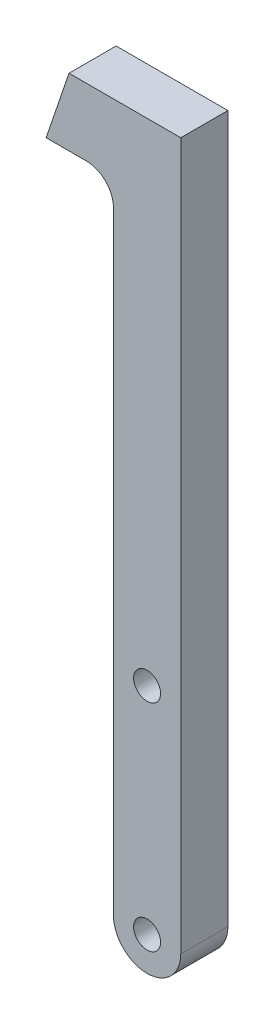
ISO-10303-21;
HEADER;
FILE_DESCRIPTION(('STEP AP214'),'2;1');
FILE_NAME('part.step','',(''),(''),'','','');
FILE_SCHEMA(('AUTOMOTIVE_DESIGN { 1 0 10303 214 1 1 1 1 }'));
ENDSEC;
DATA;
#1=APPLICATION_CONTEXT('core data for automotive mechanical design processes');
#2=APPLICATION_PROTOCOL_DEFINITION('international standard','automotive_design',2000,#1);
#3=PRODUCT_CONTEXT('',#1,'mechanical');
#4=PRODUCT('Part','Part','',(#3));
#5=PRODUCT_RELATED_PRODUCT_CATEGORY('part','',(#4));
#6=PRODUCT_DEFINITION_FORMATION('','',#4);
#7=PRODUCT_DEFINITION_CONTEXT('part definition',#1,'design');
#8=PRODUCT_DEFINITION('design','',#6,#7);
#9=PRODUCT_DEFINITION_SHAPE('','',#8);
#10=(LENGTH_UNIT() NAMED_UNIT(*) SI_UNIT(.MILLI.,.METRE.));
#11=(NAMED_UNIT(*) PLANE_ANGLE_UNIT() SI_UNIT($,.RADIAN.));
#12=(NAMED_UNIT(*) SI_UNIT($,.STERADIAN.) SOLID_ANGLE_UNIT());
#13=UNCERTAINTY_MEASURE_WITH_UNIT(LENGTH_MEASURE(1.E-05),#10,'distance_accuracy_value','');
#14=(GEOMETRIC_REPRESENTATION_CONTEXT(3) GLOBAL_UNCERTAINTY_ASSIGNED_CONTEXT((#13)) GLOBAL_UNIT_ASSIGNED_CONTEXT((#10,
#11,#12)) REPRESENTATION_CONTEXT('',''));
#15=CARTESIAN_POINT('',(0.,0.,0.));
#16=DIRECTION('',(0.,0.,1.));
#17=DIRECTION('',(1.,0.,0.));
#18=AXIS2_PLACEMENT_3D('',#15,#16,#17);
#19=CARTESIAN_POINT('',(0.,-5.,3.5));
#20=DIRECTION('',(0.,1.,0.));
#21=DIRECTION('',(0.,0.,1.));
#22=AXIS2_PLACEMENT_3D('',#19,#20,#21);
#23=PLANE('',#22);
#24=DIRECTION('',(1.,0.,0.));
#25=VECTOR('',#24,1.);
#26=CARTESIAN_POINT('',(0.,-5.,0.));
#27=LINE('',#26,#25);
#28=CARTESIAN_POINT('',(0.,-5.,0.));
#29=VERTEX_POINT('',#28);
#30=CARTESIAN_POINT('',(3.,-5.,0.));
#31=VERTEX_POINT('',#30);
#32=EDGE_CURVE('E102',#29,#31,#27,.T.);
#33=ORIENTED_EDGE('',*,*,#32,.T.);
#34=DIRECTION('',(0.,0.,-1.));
#35=VECTOR('',#34,1.);
#36=CARTESIAN_POINT('',(3.,-5.,3.5));
#37=LINE('',#36,#35);
#38=CARTESIAN_POINT('',(3.,-5.,3.5));
#39=VERTEX_POINT('',#38);
#40=EDGE_CURVE('E48',#31,#39,#37,.F.);
#41=ORIENTED_EDGE('',*,*,#40,.T.);
#42=DIRECTION('',(1.,0.,0.));
#43=VECTOR('',#42,1.);
#44=CARTESIAN_POINT('',(0.,-5.,3.5));
#45=LINE('',#44,#43);
#46=CARTESIAN_POINT('',(0.,-5.,3.5));
#47=VERTEX_POINT('',#46);
#48=EDGE_CURVE('E107',#47,#39,#45,.T.);
#49=ORIENTED_EDGE('',*,*,#48,.F.);
#50=DIRECTION('',(0.,0.,-1.));
#51=VECTOR('',#50,1.);
#52=CARTESIAN_POINT('',(0.,-5.,3.5));
#53=LINE('',#52,#51);
#54=EDGE_CURVE('E94',#47,#29,#53,.T.);
#55=ORIENTED_EDGE('',*,*,#54,.T.);
#56=EDGE_LOOP('',(#33,#41,#49,#55));
#57=FACE_BOUND('',#56,.T.);
#58=ADVANCED_FACE('F33',(#57),#23,.F.);
#59=CARTESIAN_POINT('',(5.,-5.,3.5));
#60=DIRECTION('',(1.,0.,0.));
#61=DIRECTION('',(0.,1.,0.));
#62=AXIS2_PLACEMENT_3D('',#59,#60,#61);
#63=PLANE('',#62);
#64=DIRECTION('',(0.,-1.,0.));
#65=VECTOR('',#64,1.);
#66=CARTESIAN_POINT('',(5.,-5.,3.5));
#67=LINE('',#66,#65);
#68=CARTESIAN_POINT('',(5.,-7.,3.5));
#69=VERTEX_POINT('',#68);
#70=CARTESIAN_POINT('',(5.00000000000001,-52.5,3.5));
#71=VERTEX_POINT('',#70);
#72=EDGE_CURVE('E137',#69,#71,#67,.T.);
#73=ORIENTED_EDGE('',*,*,#72,.F.);
#74=DIRECTION('',(0.,0.,-1.));
#75=VECTOR('',#74,1.);
#76=CARTESIAN_POINT('',(5.,-7.,0.));
#77=LINE('',#76,#75);
#78=CARTESIAN_POINT('',(5.,-7.,0.));
#79=VERTEX_POINT('',#78);
#80=EDGE_CURVE('E108',#69,#79,#77,.T.);
#81=ORIENTED_EDGE('',*,*,#80,.T.);
#82=DIRECTION('',(0.,-1.,0.));
#83=VECTOR('',#82,1.);
#84=CARTESIAN_POINT('',(5.,-5.,0.));
#85=LINE('',#84,#83);
#86=CARTESIAN_POINT('',(5.00000000000001,-52.5,0.));
#87=VERTEX_POINT('',#86);
#88=EDGE_CURVE('E104',#79,#87,#85,.T.);
#89=ORIENTED_EDGE('',*,*,#88,.T.);
#90=DIRECTION('',(0.,0.,-1.));
#91=VECTOR('',#90,1.);
#92=CARTESIAN_POINT('',(5.00000000000001,-52.5,3.5));
#93=LINE('',#92,#91);
#94=EDGE_CURVE('E109',#71,#87,#93,.T.);
#95=ORIENTED_EDGE('',*,*,#94,.F.);
#96=EDGE_LOOP('',(#73,#81,#89,#95));
#97=FACE_BOUND('',#96,.T.);
#98=ADVANCED_FACE('F175',(#97),#63,.F.);
#99=CARTESIAN_POINT('',(7.50000000000001,-52.5,3.5));
#100=DIRECTION('',(0.,0.,-1.));
#101=DIRECTION('',(-1.,0.,0.));
#102=AXIS2_PLACEMENT_3D('',#99,#100,#101);
#103=CYLINDRICAL_SURFACE('',#102,2.5);
#104=CARTESIAN_POINT('',(7.50000000000001,-52.5,0.));
#105=DIRECTION('',(0.,0.,1.));
#106=DIRECTION('',(1.,0.,0.));
#107=AXIS2_PLACEMENT_3D('',#104,#105,#106);
#108=CIRCLE('',#107,2.5);
#109=CARTESIAN_POINT('',(10.,-52.5,0.));
#110=VERTEX_POINT('',#109);
#111=EDGE_CURVE('E149',#87,#110,#108,.T.);
#112=ORIENTED_EDGE('',*,*,#111,.T.);
#113=DIRECTION('',(0.,0.,-1.));
#114=VECTOR('',#113,1.);
#115=CARTESIAN_POINT('',(10.,-52.5,3.5));
#116=LINE('',#115,#114);
#117=CARTESIAN_POINT('',(10.,-52.5,3.5));
#118=VERTEX_POINT('',#117);
#119=EDGE_CURVE('E114',#118,#110,#116,.T.);
#120=ORIENTED_EDGE('',*,*,#119,.F.);
#121=CARTESIAN_POINT('',(7.50000000000001,-52.5,3.5));
#122=DIRECTION('',(0.,0.,1.));
#123=DIRECTION('',(1.,0.,0.));
#124=AXIS2_PLACEMENT_3D('',#121,#122,#123);
#125=CIRCLE('',#124,2.5);
#126=EDGE_CURVE('E140',#71,#118,#125,.T.);
#127=ORIENTED_EDGE('',*,*,#126,.F.);
#128=ORIENTED_EDGE('',*,*,#94,.T.);
#129=EDGE_LOOP('',(#112,#120,#127,#128));
#130=FACE_BOUND('',#129,.T.);
#131=ADVANCED_FACE('F173',(#130),#103,.T.);
#132=CARTESIAN_POINT('',(10.,0.,3.5));
#133=DIRECTION('',(-1.,0.,0.));
#134=DIRECTION('',(0.,-1.,0.));
#135=AXIS2_PLACEMENT_3D('',#132,#133,#134);
#136=PLANE('',#135);
#137=DIRECTION('',(0.,1.,0.));
#138=VECTOR('',#137,1.);
#139=CARTESIAN_POINT('',(10.,0.,0.));
#140=LINE('',#139,#138);
#141=CARTESIAN_POINT('',(10.,0.,0.));
#142=VERTEX_POINT('',#141);
#143=EDGE_CURVE('E151',#110,#142,#140,.T.);
#144=ORIENTED_EDGE('',*,*,#143,.T.);
#145=DIRECTION('',(0.,0.,-1.));
#146=VECTOR('',#145,1.);
#147=CARTESIAN_POINT('',(10.,0.,3.5));
#148=LINE('',#147,#146);
#149=CARTESIAN_POINT('',(10.,0.,3.5));
#150=VERTEX_POINT('',#149);
#151=EDGE_CURVE('E146',#150,#142,#148,.T.);
#152=ORIENTED_EDGE('',*,*,#151,.F.);
#153=DIRECTION('',(0.,1.,0.));
#154=VECTOR('',#153,1.);
#155=CARTESIAN_POINT('',(10.,0.,3.5));
#156=LINE('',#155,#154);
#157=EDGE_CURVE('E142',#118,#150,#156,.T.);
#158=ORIENTED_EDGE('',*,*,#157,.F.);
#159=ORIENTED_EDGE('',*,*,#119,.T.);
#160=EDGE_LOOP('',(#144,#152,#158,#159));
#161=FACE_BOUND('',#160,.T.);
#162=ADVANCED_FACE('F160',(#161),#136,.F.);
#163=CARTESIAN_POINT('',(0.,0.,3.5));
#164=DIRECTION('',(0.,-1.,0.));
#165=DIRECTION('',(0.,0.,-1.));
#166=AXIS2_PLACEMENT_3D('',#163,#164,#165);
#167=PLANE('',#166);
#168=DIRECTION('',(-1.,0.,0.));
#169=VECTOR('',#168,1.);
#170=CARTESIAN_POINT('',(0.,0.,0.));
#171=LINE('',#170,#169);
#172=CARTESIAN_POINT('',(1.70093196052755,0.,0.));
#173=VERTEX_POINT('',#172);
#174=EDGE_CURVE('E138',#142,#173,#171,.T.);
#175=ORIENTED_EDGE('',*,*,#174,.T.);
#176=DIRECTION('',(0.,0.,1.));
#177=VECTOR('',#176,1.);
#178=CARTESIAN_POINT('',(1.70093196052755,0.,0.));
#179=LINE('',#178,#177);
#180=CARTESIAN_POINT('',(1.70093196052755,0.,3.5));
#181=VERTEX_POINT('',#180);
#182=EDGE_CURVE('E97',#173,#181,#179,.T.);
#183=ORIENTED_EDGE('',*,*,#182,.T.);
#184=DIRECTION('',(-1.,0.,0.));
#185=VECTOR('',#184,1.);
#186=CARTESIAN_POINT('',(0.,0.,3.5));
#187=LINE('',#186,#185);
#188=EDGE_CURVE('E144',#150,#181,#187,.T.);
#189=ORIENTED_EDGE('',*,*,#188,.F.);
#190=ORIENTED_EDGE('',*,*,#151,.T.);
#191=EDGE_LOOP('',(#175,#183,#189,#190));
#192=FACE_BOUND('',#191,.T.);
#193=ADVANCED_FACE('F166',(#192),#167,.F.);
#194=CARTESIAN_POINT('',(7.50000000000001,-52.5,3.5));
#195=DIRECTION('',(0.,0.,1.));
#196=DIRECTION('',(1.,0.,0.));
#197=AXIS2_PLACEMENT_3D('',#194,#195,#196);
#198=PLANE('',#197);
#199=DIRECTION('',(0.322060904560842,0.946718951829661,0.));
#200=VECTOR('',#199,1.);
#201=CARTESIAN_POINT('',(1.70093196052755,0.,3.5));
#202=LINE('',#201,#200);
#203=EDGE_CURVE('E100',#47,#181,#202,.T.);
#204=ORIENTED_EDGE('',*,*,#203,.F.);
#205=ORIENTED_EDGE('',*,*,#48,.T.);
#206=CARTESIAN_POINT('',(3.,-7.,3.5));
#207=DIRECTION('',(0.,0.,1.));
#208=DIRECTION('',(1.,0.,0.));
#209=AXIS2_PLACEMENT_3D('',#206,#207,#208);
#210=CIRCLE('',#209,2.);
#211=EDGE_CURVE('E11',#39,#69,#210,.F.);
#212=ORIENTED_EDGE('',*,*,#211,.T.);
#213=ORIENTED_EDGE('',*,*,#72,.T.);
#214=ORIENTED_EDGE('',*,*,#126,.T.);
#215=ORIENTED_EDGE('',*,*,#157,.T.);
#216=ORIENTED_EDGE('',*,*,#188,.T.);
#217=EDGE_LOOP('',(#204,#205,#212,#213,#214,#215,#216));
#218=FACE_BOUND('',#217,.T.);
#219=CARTESIAN_POINT('',(7.50000000000001,-36.5,3.5));
#220=DIRECTION('',(0.,0.,1.));
#221=DIRECTION('',(1.,0.,0.));
#222=AXIS2_PLACEMENT_3D('',#219,#220,#221);
#223=CIRCLE('',#222,1.);
#224=CARTESIAN_POINT('',(8.50000000000001,-36.5,3.5));
#225=VERTEX_POINT('',#224);
#226=EDGE_CURVE('E121',#225,#225,#223,.T.);
#227=ORIENTED_EDGE('',*,*,#226,.F.);
#228=EDGE_LOOP('',(#227));
#229=FACE_BOUND('',#228,.T.);
#230=CARTESIAN_POINT('',(7.50000000000001,-52.5,3.5));
#231=DIRECTION('',(0.,0.,1.));
#232=DIRECTION('',(1.,0.,0.));
#233=AXIS2_PLACEMENT_3D('',#230,#231,#232);
#234=CIRCLE('',#233,1.);
#235=CARTESIAN_POINT('',(8.50000000000001,-52.5,3.5));
#236=VERTEX_POINT('',#235);
#237=EDGE_CURVE('E105',#236,#236,#234,.T.);
#238=ORIENTED_EDGE('',*,*,#237,.F.);
#239=EDGE_LOOP('',(#238));
#240=FACE_BOUND('',#239,.T.);
#241=ADVANCED_FACE('F169',(#218,#229,#240),#198,.T.);
#242=CARTESIAN_POINT('',(7.50000000000001,-52.5,0.));
#243=DIRECTION('',(0.,0.,1.));
#244=DIRECTION('',(1.,0.,0.));
#245=AXIS2_PLACEMENT_3D('',#242,#243,#244);
#246=PLANE('',#245);
#247=CARTESIAN_POINT('',(7.50000000000001,-36.5,0.));
#248=DIRECTION('',(0.,0.,1.));
#249=DIRECTION('',(1.,0.,0.));
#250=AXIS2_PLACEMENT_3D('',#247,#248,#249);
#251=CIRCLE('',#250,1.);
#252=CARTESIAN_POINT('',(8.50000000000001,-36.5,0.));
#253=VERTEX_POINT('',#252);
#254=EDGE_CURVE('E118',#253,#253,#251,.T.);
#255=ORIENTED_EDGE('',*,*,#254,.T.);
#256=EDGE_LOOP('',(#255));
#257=FACE_BOUND('',#256,.T.);
#258=CARTESIAN_POINT('',(7.50000000000001,-52.5,0.));
#259=DIRECTION('',(0.,0.,-1.));
#260=DIRECTION('',(-1.,0.,0.));
#261=AXIS2_PLACEMENT_3D('',#258,#259,#260);
#262=CIRCLE('',#261,1.);
#263=CARTESIAN_POINT('',(6.50000000000001,-52.5,0.));
#264=VERTEX_POINT('',#263);
#265=EDGE_CURVE('E120',#264,#264,#262,.T.);
#266=ORIENTED_EDGE('',*,*,#265,.F.);
#267=EDGE_LOOP('',(#266));
#268=FACE_BOUND('',#267,.T.);
#269=ORIENTED_EDGE('',*,*,#32,.F.);
#270=DIRECTION('',(0.322060904560842,0.946718951829661,0.));
#271=VECTOR('',#270,1.);
#272=CARTESIAN_POINT('',(1.70093196052755,0.,0.));
#273=LINE('',#272,#271);
#274=EDGE_CURVE('E91',#29,#173,#273,.T.);
#275=ORIENTED_EDGE('',*,*,#274,.T.);
#276=ORIENTED_EDGE('',*,*,#174,.F.);
#277=ORIENTED_EDGE('',*,*,#143,.F.);
#278=ORIENTED_EDGE('',*,*,#111,.F.);
#279=ORIENTED_EDGE('',*,*,#88,.F.);
#280=CARTESIAN_POINT('',(3.,-7.,0.));
#281=DIRECTION('',(0.,0.,1.));
#282=DIRECTION('',(1.,0.,0.));
#283=AXIS2_PLACEMENT_3D('',#280,#281,#282);
#284=CIRCLE('',#283,2.);
#285=EDGE_CURVE('E41',#79,#31,#284,.T.);
#286=ORIENTED_EDGE('',*,*,#285,.T.);
#287=EDGE_LOOP('',(#269,#275,#276,#277,#278,#279,#286));
#288=FACE_BOUND('',#287,.T.);
#289=ADVANCED_FACE('F103',(#257,#268,#288),#246,.F.);
#290=CARTESIAN_POINT('',(7.50000000000001,-52.5,4.));
#291=DIRECTION('',(0.,0.,-1.));
#292=DIRECTION('',(-1.,0.,0.));
#293=AXIS2_PLACEMENT_3D('',#290,#291,#292);
#294=CYLINDRICAL_SURFACE('',#293,1.);
#295=ORIENTED_EDGE('',*,*,#237,.T.);
#296=EDGE_LOOP('',(#295));
#297=FACE_BOUND('',#296,.T.);
#298=ORIENTED_EDGE('',*,*,#265,.T.);
#299=EDGE_LOOP('',(#298));
#300=FACE_BOUND('',#299,.T.);
#301=ADVANCED_FACE('F199',(#297,#300),#294,.F.);
#302=CARTESIAN_POINT('',(7.50000000000001,-36.5,-6.5));
#303=DIRECTION('',(0.,0.,1.));
#304=DIRECTION('',(1.,0.,0.));
#305=AXIS2_PLACEMENT_3D('',#302,#303,#304);
#306=CYLINDRICAL_SURFACE('',#305,1.);
#307=ORIENTED_EDGE('',*,*,#226,.T.);
#308=EDGE_LOOP('',(#307));
#309=FACE_BOUND('',#308,.T.);
#310=ORIENTED_EDGE('',*,*,#254,.F.);
#311=EDGE_LOOP('',(#310));
#312=FACE_BOUND('',#311,.T.);
#313=ADVANCED_FACE('F183',(#309,#312),#306,.F.);
#314=CARTESIAN_POINT('',(1.70093196052755,0.,0.));
#315=DIRECTION('',(0.946718951829661,-0.322060904560842,0.));
#316=DIRECTION('',(0.322060904560842,0.946718951829661,0.));
#317=AXIS2_PLACEMENT_3D('',#314,#315,#316);
#318=PLANE('',#317);
#319=ORIENTED_EDGE('',*,*,#203,.T.);
#320=ORIENTED_EDGE('',*,*,#182,.F.);
#321=ORIENTED_EDGE('',*,*,#274,.F.);
#322=ORIENTED_EDGE('',*,*,#54,.F.);
#323=EDGE_LOOP('',(#319,#320,#321,#322));
#324=FACE_BOUND('',#323,.T.);
#325=ADVANCED_FACE('F92',(#324),#318,.F.);
#326=CARTESIAN_POINT('',(3.,-7.,3.5));
#327=DIRECTION('',(0.,0.,1.));
#328=DIRECTION('',(1.,0.,0.));
#329=AXIS2_PLACEMENT_3D('',#326,#327,#328);
#330=CYLINDRICAL_SURFACE('',#329,2.);
#331=ORIENTED_EDGE('',*,*,#211,.F.);
#332=ORIENTED_EDGE('',*,*,#40,.F.);
#333=ORIENTED_EDGE('',*,*,#285,.F.);
#334=ORIENTED_EDGE('',*,*,#80,.F.);
#335=EDGE_LOOP('',(#331,#332,#333,#334));
#336=FACE_BOUND('',#335,.T.);
#337=ADVANCED_FACE('F35',(#336),#330,.F.);
#338=CLOSED_SHELL('',(#58,#98,#131,#162,#193,#241,#289,#301,#313,#325,#337));
#339=MANIFOLD_SOLID_BREP('B2',#338);
#340=ADVANCED_BREP_SHAPE_REPRESENTATION('',(#18,#339),#14);
#341=SHAPE_DEFINITION_REPRESENTATION(#9,#340);
ENDSEC;
END-ISO-10303-21;
